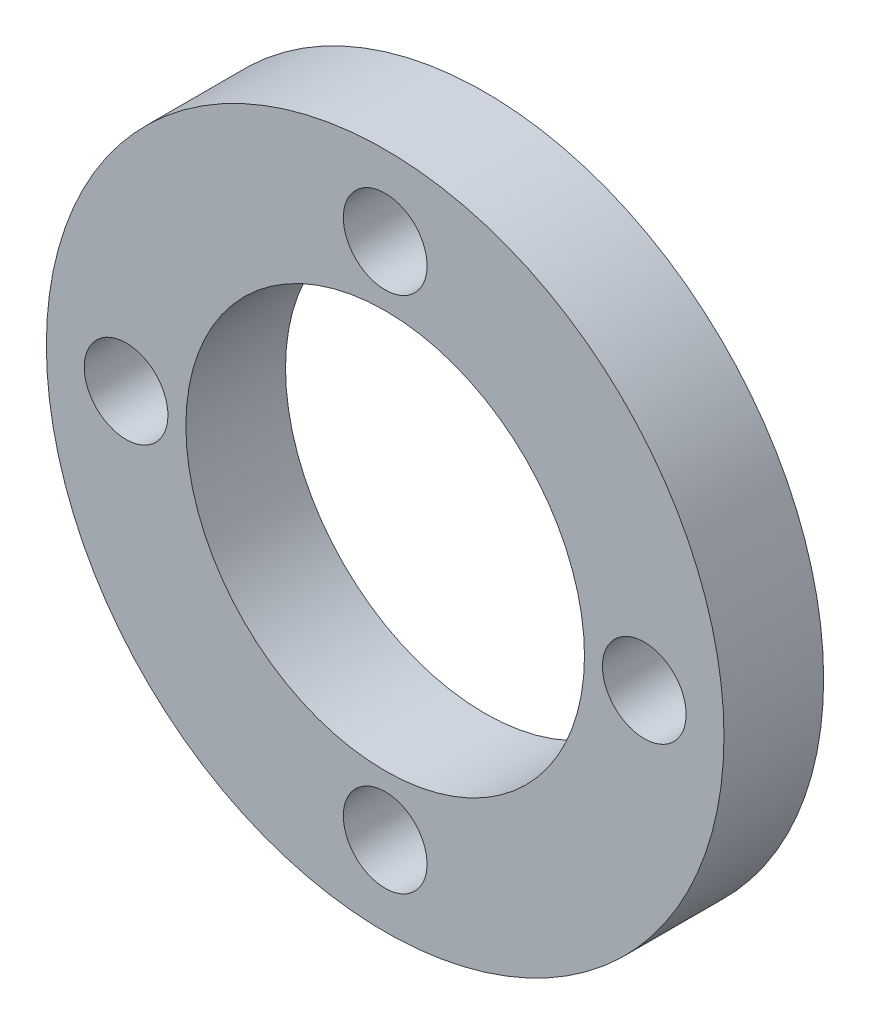
ISO-10303-21;
HEADER;
FILE_DESCRIPTION(('STEP AP214'),'2;1');
FILE_NAME('part.step','',(''),(''),'','','');
FILE_SCHEMA(('AUTOMOTIVE_DESIGN { 1 0 10303 214 1 1 1 1 }'));
ENDSEC;
DATA;
#1=APPLICATION_CONTEXT('core data for automotive mechanical design processes');
#2=APPLICATION_PROTOCOL_DEFINITION('international standard','automotive_design',2000,#1);
#3=PRODUCT_CONTEXT('',#1,'mechanical');
#4=PRODUCT('Part','Part','',(#3));
#5=PRODUCT_RELATED_PRODUCT_CATEGORY('part','',(#4));
#6=PRODUCT_DEFINITION_FORMATION('','',#4);
#7=PRODUCT_DEFINITION_CONTEXT('part definition',#1,'design');
#8=PRODUCT_DEFINITION('design','',#6,#7);
#9=PRODUCT_DEFINITION_SHAPE('','',#8);
#10=(LENGTH_UNIT() NAMED_UNIT(*) SI_UNIT(.MILLI.,.METRE.));
#11=(NAMED_UNIT(*) PLANE_ANGLE_UNIT() SI_UNIT($,.RADIAN.));
#12=(NAMED_UNIT(*) SI_UNIT($,.STERADIAN.) SOLID_ANGLE_UNIT());
#13=UNCERTAINTY_MEASURE_WITH_UNIT(LENGTH_MEASURE(1.E-05),#10,'distance_accuracy_value','');
#14=(GEOMETRIC_REPRESENTATION_CONTEXT(3) GLOBAL_UNCERTAINTY_ASSIGNED_CONTEXT((#13)) GLOBAL_UNIT_ASSIGNED_CONTEXT((#10,
#11,#12)) REPRESENTATION_CONTEXT('',''));
#15=CARTESIAN_POINT('',(0.,0.,0.));
#16=DIRECTION('',(0.,0.,1.));
#17=DIRECTION('',(1.,0.,0.));
#18=AXIS2_PLACEMENT_3D('',#15,#16,#17);
#19=CARTESIAN_POINT('',(0.,0.,5.));
#20=DIRECTION('',(0.,0.,1.));
#21=DIRECTION('',(1.,0.,0.));
#22=AXIS2_PLACEMENT_3D('',#19,#20,#21);
#23=PLANE('',#22);
#24=CARTESIAN_POINT('',(-13.,1.36167851083266E-13,5.));
#25=DIRECTION('',(0.,0.,1.));
#26=DIRECTION('',(0.,1.,0.));
#27=AXIS2_PLACEMENT_3D('',#24,#25,#26);
#28=CIRCLE('',#27,2.1);
#29=CARTESIAN_POINT('',(-13.,2.10000000000014,5.));
#30=VERTEX_POINT('',#29);
#31=EDGE_CURVE('E81',#30,#30,#28,.T.);
#32=ORIENTED_EDGE('',*,*,#31,.F.);
#33=EDGE_LOOP('',(#32));
#34=FACE_BOUND('',#33,.T.);
#35=CARTESIAN_POINT('',(0.,-13.,5.));
#36=DIRECTION('',(0.,0.,1.));
#37=DIRECTION('',(-1.,0.,0.));
#38=AXIS2_PLACEMENT_3D('',#35,#36,#37);
#39=CIRCLE('',#38,2.1);
#40=CARTESIAN_POINT('',(-2.10000000000009,-13.,5.));
#41=VERTEX_POINT('',#40);
#42=EDGE_CURVE('E75',#41,#41,#39,.T.);
#43=ORIENTED_EDGE('',*,*,#42,.F.);
#44=EDGE_LOOP('',(#43));
#45=FACE_BOUND('',#44,.T.);
#46=CARTESIAN_POINT('',(13.,0.,5.));
#47=DIRECTION('',(0.,0.,1.));
#48=DIRECTION('',(0.,-1.,0.));
#49=AXIS2_PLACEMENT_3D('',#46,#47,#48);
#50=CIRCLE('',#49,2.1);
#51=CARTESIAN_POINT('',(13.,-2.10000000000005,5.));
#52=VERTEX_POINT('',#51);
#53=EDGE_CURVE('E69',#52,#52,#50,.T.);
#54=ORIENTED_EDGE('',*,*,#53,.F.);
#55=EDGE_LOOP('',(#54));
#56=FACE_BOUND('',#55,.T.);
#57=CARTESIAN_POINT('',(0.,13.,5.));
#58=DIRECTION('',(0.,0.,1.));
#59=DIRECTION('',(1.,0.,0.));
#60=AXIS2_PLACEMENT_3D('',#57,#58,#59);
#61=CIRCLE('',#60,2.1);
#62=CARTESIAN_POINT('',(2.1,13.,5.));
#63=VERTEX_POINT('',#62);
#64=EDGE_CURVE('E63',#63,#63,#61,.T.);
#65=ORIENTED_EDGE('',*,*,#64,.F.);
#66=EDGE_LOOP('',(#65));
#67=FACE_BOUND('',#66,.T.);
#68=CARTESIAN_POINT('',(0.,0.,5.));
#69=DIRECTION('',(0.,0.,1.));
#70=DIRECTION('',(1.,0.,0.));
#71=AXIS2_PLACEMENT_3D('',#68,#69,#70);
#72=CIRCLE('',#71,17.);
#73=CARTESIAN_POINT('',(17.,0.,5.));
#74=VERTEX_POINT('',#73);
#75=EDGE_CURVE('E10',#74,#74,#72,.T.);
#76=ORIENTED_EDGE('',*,*,#75,.T.);
#77=EDGE_LOOP('',(#76));
#78=FACE_BOUND('',#77,.T.);
#79=CARTESIAN_POINT('',(0.,0.,5.));
#80=DIRECTION('',(0.,0.,1.));
#81=DIRECTION('',(1.,0.,0.));
#82=AXIS2_PLACEMENT_3D('',#79,#80,#81);
#83=CIRCLE('',#82,10.);
#84=CARTESIAN_POINT('',(10.,0.,5.));
#85=VERTEX_POINT('',#84);
#86=EDGE_CURVE('E49',#85,#85,#83,.T.);
#87=ORIENTED_EDGE('',*,*,#86,.F.);
#88=EDGE_LOOP('',(#87));
#89=FACE_BOUND('',#88,.T.);
#90=ADVANCED_FACE('F34',(#34,#45,#56,#67,#78,#89),#23,.T.);
#91=CARTESIAN_POINT('',(0.,0.,0.));
#92=DIRECTION('',(0.,0.,1.));
#93=DIRECTION('',(1.,0.,0.));
#94=AXIS2_PLACEMENT_3D('',#91,#92,#93);
#95=PLANE('',#94);
#96=CARTESIAN_POINT('',(-13.,1.36167851083266E-13,0.));
#97=DIRECTION('',(0.,0.,1.));
#98=DIRECTION('',(0.,1.,0.));
#99=AXIS2_PLACEMENT_3D('',#96,#97,#98);
#100=CIRCLE('',#99,2.1);
#101=CARTESIAN_POINT('',(-13.,2.10000000000014,0.));
#102=VERTEX_POINT('',#101);
#103=EDGE_CURVE('E78',#102,#102,#100,.T.);
#104=ORIENTED_EDGE('',*,*,#103,.T.);
#105=EDGE_LOOP('',(#104));
#106=FACE_BOUND('',#105,.T.);
#107=CARTESIAN_POINT('',(0.,-13.,0.));
#108=DIRECTION('',(0.,0.,1.));
#109=DIRECTION('',(-1.,0.,0.));
#110=AXIS2_PLACEMENT_3D('',#107,#108,#109);
#111=CIRCLE('',#110,2.1);
#112=CARTESIAN_POINT('',(-2.10000000000009,-13.,0.));
#113=VERTEX_POINT('',#112);
#114=EDGE_CURVE('E72',#113,#113,#111,.T.);
#115=ORIENTED_EDGE('',*,*,#114,.T.);
#116=EDGE_LOOP('',(#115));
#117=FACE_BOUND('',#116,.T.);
#118=CARTESIAN_POINT('',(13.,0.,0.));
#119=DIRECTION('',(0.,0.,1.));
#120=DIRECTION('',(0.,-1.,0.));
#121=AXIS2_PLACEMENT_3D('',#118,#119,#120);
#122=CIRCLE('',#121,2.1);
#123=CARTESIAN_POINT('',(13.,-2.10000000000005,0.));
#124=VERTEX_POINT('',#123);
#125=EDGE_CURVE('E66',#124,#124,#122,.T.);
#126=ORIENTED_EDGE('',*,*,#125,.T.);
#127=EDGE_LOOP('',(#126));
#128=FACE_BOUND('',#127,.T.);
#129=CARTESIAN_POINT('',(0.,13.,0.));
#130=DIRECTION('',(0.,0.,1.));
#131=DIRECTION('',(1.,0.,0.));
#132=AXIS2_PLACEMENT_3D('',#129,#130,#131);
#133=CIRCLE('',#132,2.1);
#134=CARTESIAN_POINT('',(2.1,13.,0.));
#135=VERTEX_POINT('',#134);
#136=EDGE_CURVE('E60',#135,#135,#133,.T.);
#137=ORIENTED_EDGE('',*,*,#136,.T.);
#138=EDGE_LOOP('',(#137));
#139=FACE_BOUND('',#138,.T.);
#140=CARTESIAN_POINT('',(0.,0.,0.));
#141=DIRECTION('',(0.,0.,1.));
#142=DIRECTION('',(1.,0.,0.));
#143=AXIS2_PLACEMENT_3D('',#140,#141,#142);
#144=CIRCLE('',#143,17.);
#145=CARTESIAN_POINT('',(17.,0.,0.));
#146=VERTEX_POINT('',#145);
#147=EDGE_CURVE('E42',#146,#146,#144,.T.);
#148=ORIENTED_EDGE('',*,*,#147,.F.);
#149=EDGE_LOOP('',(#148));
#150=FACE_BOUND('',#149,.T.);
#151=CARTESIAN_POINT('',(0.,0.,0.));
#152=DIRECTION('',(0.,0.,1.));
#153=DIRECTION('',(1.,0.,0.));
#154=AXIS2_PLACEMENT_3D('',#151,#152,#153);
#155=CIRCLE('',#154,10.);
#156=CARTESIAN_POINT('',(10.,0.,0.));
#157=VERTEX_POINT('',#156);
#158=EDGE_CURVE('E55',#157,#157,#155,.T.);
#159=ORIENTED_EDGE('',*,*,#158,.T.);
#160=EDGE_LOOP('',(#159));
#161=FACE_BOUND('',#160,.T.);
#162=ADVANCED_FACE('F89',(#106,#117,#128,#139,#150,#161),#95,.F.);
#163=CARTESIAN_POINT('',(0.,0.,5.));
#164=DIRECTION('',(0.,0.,-1.));
#165=DIRECTION('',(-1.,0.,0.));
#166=AXIS2_PLACEMENT_3D('',#163,#164,#165);
#167=CYLINDRICAL_SURFACE('',#166,17.);
#168=ORIENTED_EDGE('',*,*,#75,.F.);
#169=EDGE_LOOP('',(#168));
#170=FACE_BOUND('',#169,.T.);
#171=ORIENTED_EDGE('',*,*,#147,.T.);
#172=EDGE_LOOP('',(#171));
#173=FACE_BOUND('',#172,.T.);
#174=ADVANCED_FACE('F36',(#170,#173),#167,.T.);
#175=CARTESIAN_POINT('',(0.,0.,5.));
#176=DIRECTION('',(0.,0.,-1.));
#177=DIRECTION('',(-1.,0.,0.));
#178=AXIS2_PLACEMENT_3D('',#175,#176,#177);
#179=CYLINDRICAL_SURFACE('',#178,10.);
#180=ORIENTED_EDGE('',*,*,#86,.T.);
#181=EDGE_LOOP('',(#180));
#182=FACE_BOUND('',#181,.T.);
#183=ORIENTED_EDGE('',*,*,#158,.F.);
#184=EDGE_LOOP('',(#183));
#185=FACE_BOUND('',#184,.T.);
#186=ADVANCED_FACE('F98',(#182,#185),#179,.F.);
#187=CARTESIAN_POINT('',(0.,13.,0.));
#188=DIRECTION('',(0.,0.,1.));
#189=DIRECTION('',(1.,0.,0.));
#190=AXIS2_PLACEMENT_3D('',#187,#188,#189);
#191=CYLINDRICAL_SURFACE('',#190,2.1);
#192=ORIENTED_EDGE('',*,*,#136,.F.);
#193=EDGE_LOOP('',(#192));
#194=FACE_BOUND('',#193,.T.);
#195=ORIENTED_EDGE('',*,*,#64,.T.);
#196=EDGE_LOOP('',(#195));
#197=FACE_BOUND('',#196,.T.);
#198=ADVANCED_FACE('F101',(#194,#197),#191,.F.);
#199=CARTESIAN_POINT('',(13.,0.,0.));
#200=DIRECTION('',(0.,0.,1.));
#201=DIRECTION('',(1.,0.,0.));
#202=AXIS2_PLACEMENT_3D('',#199,#200,#201);
#203=CYLINDRICAL_SURFACE('',#202,2.1);
#204=ORIENTED_EDGE('',*,*,#125,.F.);
#205=EDGE_LOOP('',(#204));
#206=FACE_BOUND('',#205,.T.);
#207=ORIENTED_EDGE('',*,*,#53,.T.);
#208=EDGE_LOOP('',(#207));
#209=FACE_BOUND('',#208,.T.);
#210=ADVANCED_FACE('F115',(#206,#209),#203,.F.);
#211=CARTESIAN_POINT('',(0.,-13.,0.));
#212=DIRECTION('',(0.,0.,1.));
#213=DIRECTION('',(1.,0.,0.));
#214=AXIS2_PLACEMENT_3D('',#211,#212,#213);
#215=CYLINDRICAL_SURFACE('',#214,2.1);
#216=ORIENTED_EDGE('',*,*,#114,.F.);
#217=EDGE_LOOP('',(#216));
#218=FACE_BOUND('',#217,.T.);
#219=ORIENTED_EDGE('',*,*,#42,.T.);
#220=EDGE_LOOP('',(#219));
#221=FACE_BOUND('',#220,.T.);
#222=ADVANCED_FACE('F119',(#218,#221),#215,.F.);
#223=CARTESIAN_POINT('',(-13.,1.36167851083266E-13,0.));
#224=DIRECTION('',(0.,0.,1.));
#225=DIRECTION('',(1.,0.,0.));
#226=AXIS2_PLACEMENT_3D('',#223,#224,#225);
#227=CYLINDRICAL_SURFACE('',#226,2.1);
#228=ORIENTED_EDGE('',*,*,#103,.F.);
#229=EDGE_LOOP('',(#228));
#230=FACE_BOUND('',#229,.T.);
#231=ORIENTED_EDGE('',*,*,#31,.T.);
#232=EDGE_LOOP('',(#231));
#233=FACE_BOUND('',#232,.T.);
#234=ADVANCED_FACE('F85',(#230,#233),#227,.F.);
#235=CLOSED_SHELL('',(#90,#162,#174,#186,#198,#210,#222,#234));
#236=MANIFOLD_SOLID_BREP('B2',#235);
#237=ADVANCED_BREP_SHAPE_REPRESENTATION('',(#18,#236),#14);
#238=SHAPE_DEFINITION_REPRESENTATION(#9,#237);
ENDSEC;
END-ISO-10303-21;
